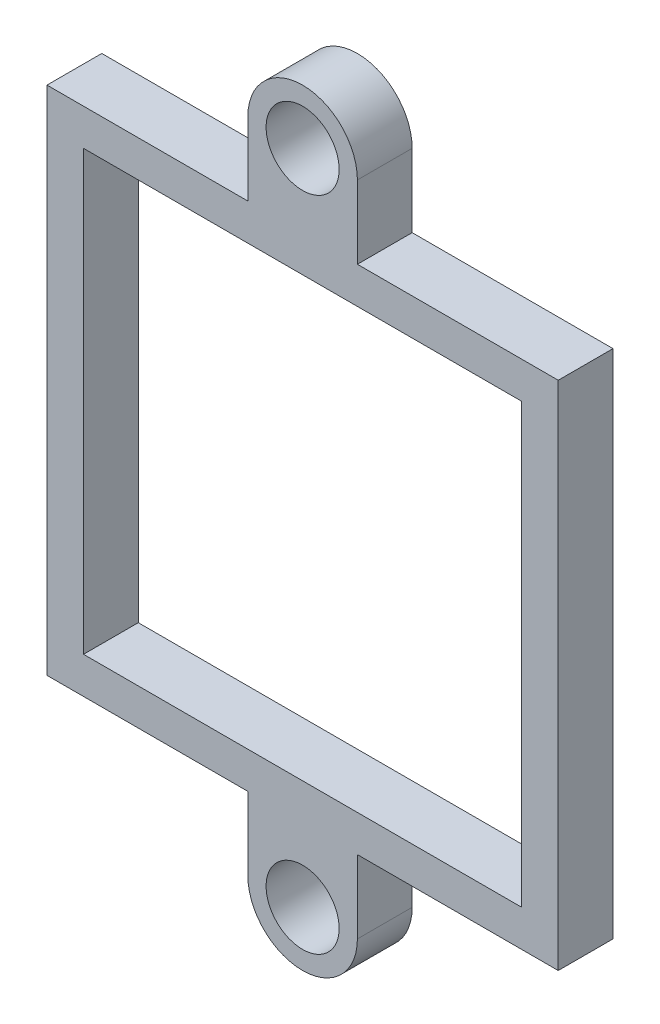
ISO-10303-21;
HEADER;
FILE_DESCRIPTION(('STEP AP214'),'2;1');
FILE_NAME('part.step','',(''),(''),'','','');
FILE_SCHEMA(('AUTOMOTIVE_DESIGN { 1 0 10303 214 1 1 1 1 }'));
ENDSEC;
DATA;
#1=APPLICATION_CONTEXT('core data for automotive mechanical design processes');
#2=APPLICATION_PROTOCOL_DEFINITION('international standard','automotive_design',2000,#1);
#3=PRODUCT_CONTEXT('',#1,'mechanical');
#4=PRODUCT('Part','Part','',(#3));
#5=PRODUCT_RELATED_PRODUCT_CATEGORY('part','',(#4));
#6=PRODUCT_DEFINITION_FORMATION('','',#4);
#7=PRODUCT_DEFINITION_CONTEXT('part definition',#1,'design');
#8=PRODUCT_DEFINITION('design','',#6,#7);
#9=PRODUCT_DEFINITION_SHAPE('','',#8);
#10=(LENGTH_UNIT() NAMED_UNIT(*) SI_UNIT(.MILLI.,.METRE.));
#11=(NAMED_UNIT(*) PLANE_ANGLE_UNIT() SI_UNIT($,.RADIAN.));
#12=(NAMED_UNIT(*) SI_UNIT($,.STERADIAN.) SOLID_ANGLE_UNIT());
#13=UNCERTAINTY_MEASURE_WITH_UNIT(LENGTH_MEASURE(1.E-05),#10,'distance_accuracy_value','');
#14=(GEOMETRIC_REPRESENTATION_CONTEXT(3) GLOBAL_UNCERTAINTY_ASSIGNED_CONTEXT((#13)) GLOBAL_UNIT_ASSIGNED_CONTEXT((#10,
#11,#12)) REPRESENTATION_CONTEXT('',''));
#15=CARTESIAN_POINT('',(0.,0.,0.));
#16=DIRECTION('',(0.,0.,1.));
#17=DIRECTION('',(1.,0.,0.));
#18=AXIS2_PLACEMENT_3D('',#15,#16,#17);
#19=CARTESIAN_POINT('',(-1.5,10.5,0.));
#20=DIRECTION('',(-1.,0.,0.));
#21=DIRECTION('',(0.,0.,1.));
#22=AXIS2_PLACEMENT_3D('',#19,#20,#21);
#23=PLANE('',#22);
#24=DIRECTION('',(0.,-1.,0.));
#25=VECTOR('',#24,1.);
#26=CARTESIAN_POINT('',(-1.5,10.5,1.5));
#27=LINE('',#26,#25);
#28=CARTESIAN_POINT('',(-1.5,9.,1.5));
#29=VERTEX_POINT('',#28);
#30=CARTESIAN_POINT('',(-1.5,7.,1.5));
#31=VERTEX_POINT('',#30);
#32=EDGE_CURVE('E204',#29,#31,#27,.T.);
#33=ORIENTED_EDGE('',*,*,#32,.F.);
#34=DIRECTION('',(0.,0.,1.));
#35=VECTOR('',#34,1.);
#36=CARTESIAN_POINT('',(-1.5,9.,-2.5));
#37=LINE('',#36,#35);
#38=CARTESIAN_POINT('',(-1.5,9.,0.));
#39=VERTEX_POINT('',#38);
#40=EDGE_CURVE('E190',#39,#29,#37,.T.);
#41=ORIENTED_EDGE('',*,*,#40,.F.);
#42=DIRECTION('',(0.,-1.,0.));
#43=VECTOR('',#42,1.);
#44=CARTESIAN_POINT('',(-1.5,10.5,0.));
#45=LINE('',#44,#43);
#46=CARTESIAN_POINT('',(-1.5,7.,0.));
#47=VERTEX_POINT('',#46);
#48=EDGE_CURVE('E87',#39,#47,#45,.T.);
#49=ORIENTED_EDGE('',*,*,#48,.T.);
#50=DIRECTION('',(0.,0.,-1.));
#51=VECTOR('',#50,1.);
#52=CARTESIAN_POINT('',(-1.5,7.,0.));
#53=LINE('',#52,#51);
#54=EDGE_CURVE('E205',#31,#47,#53,.T.);
#55=ORIENTED_EDGE('',*,*,#54,.F.);
#56=EDGE_LOOP('',(#33,#41,#49,#55));
#57=FACE_BOUND('',#56,.T.);
#58=ADVANCED_FACE('F71',(#57),#23,.T.);
#59=CARTESIAN_POINT('',(-7.,7.,1.5));
#60=DIRECTION('',(0.,-1.,0.));
#61=DIRECTION('',(1.,0.,0.));
#62=AXIS2_PLACEMENT_3D('',#59,#60,#61);
#63=PLANE('',#62);
#64=DIRECTION('',(-1.,0.,0.));
#65=VECTOR('',#64,1.);
#66=CARTESIAN_POINT('',(-7.,7.,0.));
#67=LINE('',#66,#65);
#68=CARTESIAN_POINT('',(7.,7.,0.));
#69=VERTEX_POINT('',#68);
#70=CARTESIAN_POINT('',(1.5,7.,0.));
#71=VERTEX_POINT('',#70);
#72=EDGE_CURVE('E275',#69,#71,#67,.T.);
#73=ORIENTED_EDGE('',*,*,#72,.T.);
#74=DIRECTION('',(0.,0.,1.));
#75=VECTOR('',#74,1.);
#76=CARTESIAN_POINT('',(1.5,7.,0.));
#77=LINE('',#76,#75);
#78=CARTESIAN_POINT('',(1.5,7.,1.5));
#79=VERTEX_POINT('',#78);
#80=EDGE_CURVE('E208',#71,#79,#77,.T.);
#81=ORIENTED_EDGE('',*,*,#80,.T.);
#82=DIRECTION('',(-1.,0.,0.));
#83=VECTOR('',#82,1.);
#84=CARTESIAN_POINT('',(-7.,7.,1.5));
#85=LINE('',#84,#83);
#86=CARTESIAN_POINT('',(7.,7.,1.5));
#87=VERTEX_POINT('',#86);
#88=EDGE_CURVE('E203',#87,#79,#85,.T.);
#89=ORIENTED_EDGE('',*,*,#88,.F.);
#90=DIRECTION('',(0.,0.,-1.));
#91=VECTOR('',#90,1.);
#92=CARTESIAN_POINT('',(7.,7.,1.5));
#93=LINE('',#92,#91);
#94=EDGE_CURVE('E297',#87,#69,#93,.T.);
#95=ORIENTED_EDGE('',*,*,#94,.T.);
#96=EDGE_LOOP('',(#73,#81,#89,#95));
#97=FACE_BOUND('',#96,.T.);
#98=ADVANCED_FACE('F348',(#97),#63,.F.);
#99=CARTESIAN_POINT('',(0.,0.,1.5));
#100=DIRECTION('',(0.,0.,-1.));
#101=DIRECTION('',(-1.,0.,0.));
#102=AXIS2_PLACEMENT_3D('',#99,#100,#101);
#103=PLANE('',#102);
#104=CARTESIAN_POINT('',(0.,9.,1.5));
#105=DIRECTION('',(0.,0.,-1.));
#106=DIRECTION('',(1.,0.,0.));
#107=AXIS2_PLACEMENT_3D('',#104,#105,#106);
#108=CIRCLE('',#107,1.);
#109=CARTESIAN_POINT('',(1.,9.,1.5));
#110=VERTEX_POINT('',#109);
#111=EDGE_CURVE('E395',#110,#110,#108,.T.);
#112=ORIENTED_EDGE('',*,*,#111,.T.);
#113=EDGE_LOOP('',(#112));
#114=FACE_BOUND('',#113,.T.);
#115=CARTESIAN_POINT('',(0.,-9.,1.5));
#116=DIRECTION('',(0.,0.,1.));
#117=DIRECTION('',(1.,0.,0.));
#118=AXIS2_PLACEMENT_3D('',#115,#116,#117);
#119=CIRCLE('',#118,1.);
#120=CARTESIAN_POINT('',(1.,-9.,1.5));
#121=VERTEX_POINT('',#120);
#122=EDGE_CURVE('E214',#121,#121,#119,.T.);
#123=ORIENTED_EDGE('',*,*,#122,.F.);
#124=EDGE_LOOP('',(#123));
#125=FACE_BOUND('',#124,.T.);
#126=DIRECTION('',(0.,1.,0.));
#127=VECTOR('',#126,1.);
#128=CARTESIAN_POINT('',(6.,-6.,1.5));
#129=LINE('',#128,#127);
#130=CARTESIAN_POINT('',(6.,-6.,1.5));
#131=VERTEX_POINT('',#130);
#132=CARTESIAN_POINT('',(6.,6.,1.5));
#133=VERTEX_POINT('',#132);
#134=EDGE_CURVE('E240',#131,#133,#129,.T.);
#135=ORIENTED_EDGE('',*,*,#134,.F.);
#136=DIRECTION('',(1.,0.,0.));
#137=VECTOR('',#136,1.);
#138=CARTESIAN_POINT('',(-6.,-6.,1.5));
#139=LINE('',#138,#137);
#140=CARTESIAN_POINT('',(-6.,-6.,1.5));
#141=VERTEX_POINT('',#140);
#142=EDGE_CURVE('E248',#141,#131,#139,.T.);
#143=ORIENTED_EDGE('',*,*,#142,.F.);
#144=DIRECTION('',(0.,-1.,0.));
#145=VECTOR('',#144,1.);
#146=CARTESIAN_POINT('',(-6.,-6.,1.5));
#147=LINE('',#146,#145);
#148=CARTESIAN_POINT('',(-6.,6.,1.5));
#149=VERTEX_POINT('',#148);
#150=EDGE_CURVE('E245',#149,#141,#147,.T.);
#151=ORIENTED_EDGE('',*,*,#150,.F.);
#152=DIRECTION('',(-1.,0.,0.));
#153=VECTOR('',#152,1.);
#154=CARTESIAN_POINT('',(-6.,6.,1.5));
#155=LINE('',#154,#153);
#156=EDGE_CURVE('E242',#133,#149,#155,.T.);
#157=ORIENTED_EDGE('',*,*,#156,.F.);
#158=EDGE_LOOP('',(#135,#143,#151,#157));
#159=FACE_BOUND('',#158,.T.);
#160=DIRECTION('',(0.,-1.,0.));
#161=VECTOR('',#160,1.);
#162=CARTESIAN_POINT('',(1.5,10.5,1.5));
#163=LINE('',#162,#161);
#164=CARTESIAN_POINT('',(1.5,9.,1.5));
#165=VERTEX_POINT('',#164);
#166=EDGE_CURVE('E197',#165,#79,#163,.T.);
#167=ORIENTED_EDGE('',*,*,#166,.F.);
#168=CARTESIAN_POINT('',(0.,9.,1.5));
#169=DIRECTION('',(0.,0.,-1.));
#170=DIRECTION('',(1.,0.,0.));
#171=AXIS2_PLACEMENT_3D('',#168,#169,#170);
#172=CIRCLE('',#171,1.5);
#173=EDGE_CURVE('E186',#29,#165,#172,.T.);
#174=ORIENTED_EDGE('',*,*,#173,.F.);
#175=ORIENTED_EDGE('',*,*,#32,.T.);
#176=CARTESIAN_POINT('',(-7.,7.,1.5));
#177=VERTEX_POINT('',#176);
#178=EDGE_CURVE('E281',#31,#177,#85,.T.);
#179=ORIENTED_EDGE('',*,*,#178,.T.);
#180=DIRECTION('',(0.,-1.,0.));
#181=VECTOR('',#180,1.);
#182=CARTESIAN_POINT('',(-7.,-7.,1.5));
#183=LINE('',#182,#181);
#184=CARTESIAN_POINT('',(-7.,-7.,1.5));
#185=VERTEX_POINT('',#184);
#186=EDGE_CURVE('E271',#177,#185,#183,.T.);
#187=ORIENTED_EDGE('',*,*,#186,.T.);
#188=DIRECTION('',(1.,0.,0.));
#189=VECTOR('',#188,1.);
#190=CARTESIAN_POINT('',(-7.,-7.,1.5));
#191=LINE('',#190,#189);
#192=CARTESIAN_POINT('',(-1.5,-7.,1.5));
#193=VERTEX_POINT('',#192);
#194=EDGE_CURVE('E276',#185,#193,#191,.T.);
#195=ORIENTED_EDGE('',*,*,#194,.T.);
#196=DIRECTION('',(0.,1.,0.));
#197=VECTOR('',#196,1.);
#198=CARTESIAN_POINT('',(-1.5,-10.5,1.5));
#199=LINE('',#198,#197);
#200=CARTESIAN_POINT('',(-1.5,-9.,1.5));
#201=VERTEX_POINT('',#200);
#202=EDGE_CURVE('E236',#201,#193,#199,.T.);
#203=ORIENTED_EDGE('',*,*,#202,.F.);
#204=CARTESIAN_POINT('',(0.,-9.,1.5));
#205=DIRECTION('',(0.,0.,1.));
#206=DIRECTION('',(1.,0.,0.));
#207=AXIS2_PLACEMENT_3D('',#204,#205,#206);
#208=CIRCLE('',#207,1.5);
#209=CARTESIAN_POINT('',(1.5,-9.,1.5));
#210=VERTEX_POINT('',#209);
#211=EDGE_CURVE('E218',#201,#210,#208,.T.);
#212=ORIENTED_EDGE('',*,*,#211,.T.);
#213=DIRECTION('',(0.,1.,0.));
#214=VECTOR('',#213,1.);
#215=CARTESIAN_POINT('',(1.5,-10.5,1.5));
#216=LINE('',#215,#214);
#217=CARTESIAN_POINT('',(1.5,-7.,1.5));
#218=VERTEX_POINT('',#217);
#219=EDGE_CURVE('E95',#210,#218,#216,.T.);
#220=ORIENTED_EDGE('',*,*,#219,.T.);
#221=CARTESIAN_POINT('',(7.,-7.,1.5));
#222=VERTEX_POINT('',#221);
#223=EDGE_CURVE('E274',#218,#222,#191,.T.);
#224=ORIENTED_EDGE('',*,*,#223,.T.);
#225=DIRECTION('',(0.,1.,0.));
#226=VECTOR('',#225,1.);
#227=CARTESIAN_POINT('',(7.,-7.,1.5));
#228=LINE('',#227,#226);
#229=EDGE_CURVE('E279',#222,#87,#228,.T.);
#230=ORIENTED_EDGE('',*,*,#229,.T.);
#231=ORIENTED_EDGE('',*,*,#88,.T.);
#232=EDGE_LOOP('',(#167,#174,#175,#179,#187,#195,#203,#212,#220,#224,#230,#231));
#233=FACE_BOUND('',#232,.T.);
#234=ADVANCED_FACE('F201',(#114,#125,#159,#233),#103,.F.);
#235=CARTESIAN_POINT('',(0.,0.,0.));
#236=DIRECTION('',(0.,0.,-1.));
#237=DIRECTION('',(-1.,0.,0.));
#238=AXIS2_PLACEMENT_3D('',#235,#236,#237);
#239=PLANE('',#238);
#240=CARTESIAN_POINT('',(0.,9.,0.));
#241=DIRECTION('',(0.,0.,-1.));
#242=DIRECTION('',(-1.,0.,0.));
#243=AXIS2_PLACEMENT_3D('',#240,#241,#242);
#244=CIRCLE('',#243,1.);
#245=CARTESIAN_POINT('',(-1.,9.,0.));
#246=VERTEX_POINT('',#245);
#247=EDGE_CURVE('E75',#246,#246,#244,.F.);
#248=ORIENTED_EDGE('',*,*,#247,.T.);
#249=EDGE_LOOP('',(#248));
#250=FACE_BOUND('',#249,.T.);
#251=CARTESIAN_POINT('',(0.,9.,0.));
#252=DIRECTION('',(0.,0.,-1.));
#253=DIRECTION('',(-1.,0.,0.));
#254=AXIS2_PLACEMENT_3D('',#251,#252,#253);
#255=CIRCLE('',#254,1.5);
#256=CARTESIAN_POINT('',(1.5,9.,0.));
#257=VERTEX_POINT('',#256);
#258=EDGE_CURVE('E391',#257,#39,#255,.F.);
#259=ORIENTED_EDGE('',*,*,#258,.F.);
#260=DIRECTION('',(0.,-1.,0.));
#261=VECTOR('',#260,1.);
#262=CARTESIAN_POINT('',(1.5,10.5,0.));
#263=LINE('',#262,#261);
#264=EDGE_CURVE('E199',#257,#71,#263,.T.);
#265=ORIENTED_EDGE('',*,*,#264,.T.);
#266=ORIENTED_EDGE('',*,*,#72,.F.);
#267=DIRECTION('',(0.,1.,0.));
#268=VECTOR('',#267,1.);
#269=CARTESIAN_POINT('',(7.,-7.,0.));
#270=LINE('',#269,#268);
#271=CARTESIAN_POINT('',(7.,-7.,0.));
#272=VERTEX_POINT('',#271);
#273=EDGE_CURVE('E290',#272,#69,#270,.T.);
#274=ORIENTED_EDGE('',*,*,#273,.F.);
#275=DIRECTION('',(1.,0.,0.));
#276=VECTOR('',#275,1.);
#277=CARTESIAN_POINT('',(-7.,-7.,0.));
#278=LINE('',#277,#276);
#279=CARTESIAN_POINT('',(1.5,-7.,0.));
#280=VERTEX_POINT('',#279);
#281=EDGE_CURVE('E286',#280,#272,#278,.T.);
#282=ORIENTED_EDGE('',*,*,#281,.F.);
#283=DIRECTION('',(0.,1.,0.));
#284=VECTOR('',#283,1.);
#285=CARTESIAN_POINT('',(1.5,-10.5,0.));
#286=LINE('',#285,#284);
#287=CARTESIAN_POINT('',(1.5,-9.,0.));
#288=VERTEX_POINT('',#287);
#289=EDGE_CURVE('E232',#288,#280,#286,.T.);
#290=ORIENTED_EDGE('',*,*,#289,.F.);
#291=CARTESIAN_POINT('',(0.,-9.,0.));
#292=DIRECTION('',(0.,0.,-1.));
#293=DIRECTION('',(-1.,0.,0.));
#294=AXIS2_PLACEMENT_3D('',#291,#292,#293);
#295=CIRCLE('',#294,1.5);
#296=CARTESIAN_POINT('',(-1.5,-9.,0.));
#297=VERTEX_POINT('',#296);
#298=EDGE_CURVE('E223',#288,#297,#295,.T.);
#299=ORIENTED_EDGE('',*,*,#298,.T.);
#300=DIRECTION('',(0.,1.,0.));
#301=VECTOR('',#300,1.);
#302=CARTESIAN_POINT('',(-1.5,-10.5,0.));
#303=LINE('',#302,#301);
#304=CARTESIAN_POINT('',(-1.5,-7.,0.));
#305=VERTEX_POINT('',#304);
#306=EDGE_CURVE('E234',#297,#305,#303,.T.);
#307=ORIENTED_EDGE('',*,*,#306,.T.);
#308=CARTESIAN_POINT('',(-7.,-7.,0.));
#309=VERTEX_POINT('',#308);
#310=EDGE_CURVE('E287',#309,#305,#278,.T.);
#311=ORIENTED_EDGE('',*,*,#310,.F.);
#312=DIRECTION('',(0.,-1.,0.));
#313=VECTOR('',#312,1.);
#314=CARTESIAN_POINT('',(-7.,-7.,0.));
#315=LINE('',#314,#313);
#316=CARTESIAN_POINT('',(-7.,7.,0.));
#317=VERTEX_POINT('',#316);
#318=EDGE_CURVE('E270',#317,#309,#315,.T.);
#319=ORIENTED_EDGE('',*,*,#318,.F.);
#320=EDGE_CURVE('E292',#47,#317,#67,.T.);
#321=ORIENTED_EDGE('',*,*,#320,.F.);
#322=ORIENTED_EDGE('',*,*,#48,.F.);
#323=EDGE_LOOP('',(#259,#265,#266,#274,#282,#290,#299,#307,#311,#319,#321,#322));
#324=FACE_BOUND('',#323,.T.);
#325=CARTESIAN_POINT('',(0.,-9.,0.));
#326=DIRECTION('',(0.,0.,-1.));
#327=DIRECTION('',(-1.,0.,0.));
#328=AXIS2_PLACEMENT_3D('',#325,#326,#327);
#329=CIRCLE('',#328,1.);
#330=CARTESIAN_POINT('',(-1.,-9.,0.));
#331=VERTEX_POINT('',#330);
#332=EDGE_CURVE('E217',#331,#331,#329,.T.);
#333=ORIENTED_EDGE('',*,*,#332,.F.);
#334=EDGE_LOOP('',(#333));
#335=FACE_BOUND('',#334,.T.);
#336=DIRECTION('',(1.,0.,0.));
#337=VECTOR('',#336,1.);
#338=CARTESIAN_POINT('',(-6.,-6.,0.));
#339=LINE('',#338,#337);
#340=CARTESIAN_POINT('',(-6.,-6.,0.));
#341=VERTEX_POINT('',#340);
#342=CARTESIAN_POINT('',(6.,-6.,0.));
#343=VERTEX_POINT('',#342);
#344=EDGE_CURVE('E243',#341,#343,#339,.T.);
#345=ORIENTED_EDGE('',*,*,#344,.T.);
#346=DIRECTION('',(0.,1.,0.));
#347=VECTOR('',#346,1.);
#348=CARTESIAN_POINT('',(6.,-6.,0.));
#349=LINE('',#348,#347);
#350=CARTESIAN_POINT('',(6.,6.,0.));
#351=VERTEX_POINT('',#350);
#352=EDGE_CURVE('E239',#343,#351,#349,.T.);
#353=ORIENTED_EDGE('',*,*,#352,.T.);
#354=DIRECTION('',(-1.,0.,0.));
#355=VECTOR('',#354,1.);
#356=CARTESIAN_POINT('',(-6.,6.,0.));
#357=LINE('',#356,#355);
#358=CARTESIAN_POINT('',(-6.,6.,0.));
#359=VERTEX_POINT('',#358);
#360=EDGE_CURVE('E253',#351,#359,#357,.T.);
#361=ORIENTED_EDGE('',*,*,#360,.T.);
#362=DIRECTION('',(0.,-1.,0.));
#363=VECTOR('',#362,1.);
#364=CARTESIAN_POINT('',(-6.,-6.,0.));
#365=LINE('',#364,#363);
#366=EDGE_CURVE('E256',#359,#341,#365,.T.);
#367=ORIENTED_EDGE('',*,*,#366,.T.);
#368=EDGE_LOOP('',(#345,#353,#361,#367));
#369=FACE_BOUND('',#368,.T.);
#370=ADVANCED_FACE('F314',(#250,#324,#335,#369),#239,.T.);
#371=CARTESIAN_POINT('',(1.5,-10.5,0.));
#372=DIRECTION('',(-1.,0.,0.));
#373=DIRECTION('',(0.,0.,1.));
#374=AXIS2_PLACEMENT_3D('',#371,#372,#373);
#375=PLANE('',#374);
#376=DIRECTION('',(0.,0.,1.));
#377=VECTOR('',#376,1.);
#378=CARTESIAN_POINT('',(1.5,-9.,-2.5));
#379=LINE('',#378,#377);
#380=EDGE_CURVE('E80',#288,#210,#379,.T.);
#381=ORIENTED_EDGE('',*,*,#380,.F.);
#382=ORIENTED_EDGE('',*,*,#289,.T.);
#383=DIRECTION('',(0.,0.,1.));
#384=VECTOR('',#383,1.);
#385=CARTESIAN_POINT('',(1.5,-7.,0.));
#386=LINE('',#385,#384);
#387=EDGE_CURVE('E226',#280,#218,#386,.T.);
#388=ORIENTED_EDGE('',*,*,#387,.T.);
#389=ORIENTED_EDGE('',*,*,#219,.F.);
#390=EDGE_LOOP('',(#381,#382,#388,#389));
#391=FACE_BOUND('',#390,.T.);
#392=ADVANCED_FACE('F317',(#391),#375,.F.);
#393=CARTESIAN_POINT('',(-7.,-7.,1.5));
#394=DIRECTION('',(0.,1.,0.));
#395=DIRECTION('',(0.,0.,1.));
#396=AXIS2_PLACEMENT_3D('',#393,#394,#395);
#397=PLANE('',#396);
#398=ORIENTED_EDGE('',*,*,#387,.F.);
#399=ORIENTED_EDGE('',*,*,#281,.T.);
#400=DIRECTION('',(0.,0.,-1.));
#401=VECTOR('',#400,1.);
#402=CARTESIAN_POINT('',(7.,-7.,1.5));
#403=LINE('',#402,#401);
#404=EDGE_CURVE('E300',#222,#272,#403,.T.);
#405=ORIENTED_EDGE('',*,*,#404,.F.);
#406=ORIENTED_EDGE('',*,*,#223,.F.);
#407=EDGE_LOOP('',(#398,#399,#405,#406));
#408=FACE_BOUND('',#407,.T.);
#409=ADVANCED_FACE('F371',(#408),#397,.F.);
#410=DIRECTION('',(0.,0.,-1.));
#411=VECTOR('',#410,1.);
#412=CARTESIAN_POINT('',(-1.5,-7.,0.));
#413=LINE('',#412,#411);
#414=EDGE_CURVE('E229',#193,#305,#413,.T.);
#415=ORIENTED_EDGE('',*,*,#414,.F.);
#416=ORIENTED_EDGE('',*,*,#194,.F.);
#417=DIRECTION('',(0.,0.,-1.));
#418=VECTOR('',#417,1.);
#419=CARTESIAN_POINT('',(-7.,-7.,1.5));
#420=LINE('',#419,#418);
#421=EDGE_CURVE('E303',#185,#309,#420,.T.);
#422=ORIENTED_EDGE('',*,*,#421,.T.);
#423=ORIENTED_EDGE('',*,*,#310,.T.);
#424=EDGE_LOOP('',(#415,#416,#422,#423));
#425=FACE_BOUND('',#424,.T.);
#426=ADVANCED_FACE('F376',(#425),#397,.F.);
#427=CARTESIAN_POINT('',(-7.,-7.,1.5));
#428=DIRECTION('',(1.,0.,0.));
#429=DIRECTION('',(0.,0.,-1.));
#430=AXIS2_PLACEMENT_3D('',#427,#428,#429);
#431=PLANE('',#430);
#432=ORIENTED_EDGE('',*,*,#318,.T.);
#433=ORIENTED_EDGE('',*,*,#421,.F.);
#434=ORIENTED_EDGE('',*,*,#186,.F.);
#435=DIRECTION('',(0.,0.,-1.));
#436=VECTOR('',#435,1.);
#437=CARTESIAN_POINT('',(-7.,7.,1.5));
#438=LINE('',#437,#436);
#439=EDGE_CURVE('E283',#177,#317,#438,.T.);
#440=ORIENTED_EDGE('',*,*,#439,.T.);
#441=EDGE_LOOP('',(#432,#433,#434,#440));
#442=FACE_BOUND('',#441,.T.);
#443=ADVANCED_FACE('F73',(#442),#431,.F.);
#444=CARTESIAN_POINT('',(7.,-7.,1.5));
#445=DIRECTION('',(-1.,0.,0.));
#446=DIRECTION('',(0.,-1.,0.));
#447=AXIS2_PLACEMENT_3D('',#444,#445,#446);
#448=PLANE('',#447);
#449=ORIENTED_EDGE('',*,*,#273,.T.);
#450=ORIENTED_EDGE('',*,*,#94,.F.);
#451=ORIENTED_EDGE('',*,*,#229,.F.);
#452=ORIENTED_EDGE('',*,*,#404,.T.);
#453=EDGE_LOOP('',(#449,#450,#451,#452));
#454=FACE_BOUND('',#453,.T.);
#455=ADVANCED_FACE('F389',(#454),#448,.F.);
#456=ORIENTED_EDGE('',*,*,#178,.F.);
#457=ORIENTED_EDGE('',*,*,#54,.T.);
#458=ORIENTED_EDGE('',*,*,#320,.T.);
#459=ORIENTED_EDGE('',*,*,#439,.F.);
#460=EDGE_LOOP('',(#456,#457,#458,#459));
#461=FACE_BOUND('',#460,.T.);
#462=ADVANCED_FACE('F355',(#461),#63,.F.);
#463=CARTESIAN_POINT('',(6.,-6.,1.5));
#464=DIRECTION('',(-1.,0.,0.));
#465=DIRECTION('',(0.,0.,1.));
#466=AXIS2_PLACEMENT_3D('',#463,#464,#465);
#467=PLANE('',#466);
#468=ORIENTED_EDGE('',*,*,#352,.F.);
#469=DIRECTION('',(0.,0.,-1.));
#470=VECTOR('',#469,1.);
#471=CARTESIAN_POINT('',(6.,-6.,1.5));
#472=LINE('',#471,#470);
#473=EDGE_CURVE('E250',#131,#343,#472,.T.);
#474=ORIENTED_EDGE('',*,*,#473,.F.);
#475=ORIENTED_EDGE('',*,*,#134,.T.);
#476=DIRECTION('',(0.,0.,-1.));
#477=VECTOR('',#476,1.);
#478=CARTESIAN_POINT('',(6.,6.,1.5));
#479=LINE('',#478,#477);
#480=EDGE_CURVE('E267',#133,#351,#479,.T.);
#481=ORIENTED_EDGE('',*,*,#480,.T.);
#482=EDGE_LOOP('',(#468,#474,#475,#481));
#483=FACE_BOUND('',#482,.T.);
#484=ADVANCED_FACE('F328',(#483),#467,.T.);
#485=CARTESIAN_POINT('',(-6.,6.,1.5));
#486=DIRECTION('',(0.,-1.,0.));
#487=DIRECTION('',(0.,0.,-1.));
#488=AXIS2_PLACEMENT_3D('',#485,#486,#487);
#489=PLANE('',#488);
#490=ORIENTED_EDGE('',*,*,#360,.F.);
#491=ORIENTED_EDGE('',*,*,#480,.F.);
#492=ORIENTED_EDGE('',*,*,#156,.T.);
#493=DIRECTION('',(0.,0.,-1.));
#494=VECTOR('',#493,1.);
#495=CARTESIAN_POINT('',(-6.,6.,1.5));
#496=LINE('',#495,#494);
#497=EDGE_CURVE('E265',#149,#359,#496,.T.);
#498=ORIENTED_EDGE('',*,*,#497,.T.);
#499=EDGE_LOOP('',(#490,#491,#492,#498));
#500=FACE_BOUND('',#499,.T.);
#501=ADVANCED_FACE('F335',(#500),#489,.T.);
#502=CARTESIAN_POINT('',(-6.,-6.,1.5));
#503=DIRECTION('',(1.,0.,0.));
#504=DIRECTION('',(0.,0.,-1.));
#505=AXIS2_PLACEMENT_3D('',#502,#503,#504);
#506=PLANE('',#505);
#507=ORIENTED_EDGE('',*,*,#366,.F.);
#508=ORIENTED_EDGE('',*,*,#497,.F.);
#509=ORIENTED_EDGE('',*,*,#150,.T.);
#510=DIRECTION('',(0.,0.,-1.));
#511=VECTOR('',#510,1.);
#512=CARTESIAN_POINT('',(-6.,-6.,1.5));
#513=LINE('',#512,#511);
#514=EDGE_CURVE('E263',#141,#341,#513,.T.);
#515=ORIENTED_EDGE('',*,*,#514,.T.);
#516=EDGE_LOOP('',(#507,#508,#509,#515));
#517=FACE_BOUND('',#516,.T.);
#518=ADVANCED_FACE('F337',(#517),#506,.T.);
#519=CARTESIAN_POINT('',(-6.,-6.,1.5));
#520=DIRECTION('',(0.,1.,0.));
#521=DIRECTION('',(0.,0.,1.));
#522=AXIS2_PLACEMENT_3D('',#519,#520,#521);
#523=PLANE('',#522);
#524=ORIENTED_EDGE('',*,*,#344,.F.);
#525=ORIENTED_EDGE('',*,*,#514,.F.);
#526=ORIENTED_EDGE('',*,*,#142,.T.);
#527=ORIENTED_EDGE('',*,*,#473,.T.);
#528=EDGE_LOOP('',(#524,#525,#526,#527));
#529=FACE_BOUND('',#528,.T.);
#530=ADVANCED_FACE('F323',(#529),#523,.T.);
#531=CARTESIAN_POINT('',(-1.5,-10.5,0.));
#532=DIRECTION('',(1.,0.,0.));
#533=DIRECTION('',(0.,0.,-1.));
#534=AXIS2_PLACEMENT_3D('',#531,#532,#533);
#535=PLANE('',#534);
#536=ORIENTED_EDGE('',*,*,#306,.F.);
#537=DIRECTION('',(0.,0.,1.));
#538=VECTOR('',#537,1.);
#539=CARTESIAN_POINT('',(-1.5,-9.,-2.5));
#540=LINE('',#539,#538);
#541=EDGE_CURVE('E220',#297,#201,#540,.T.);
#542=ORIENTED_EDGE('',*,*,#541,.T.);
#543=ORIENTED_EDGE('',*,*,#202,.T.);
#544=ORIENTED_EDGE('',*,*,#414,.T.);
#545=EDGE_LOOP('',(#536,#542,#543,#544));
#546=FACE_BOUND('',#545,.T.);
#547=ADVANCED_FACE('F344',(#546),#535,.F.);
#548=CARTESIAN_POINT('',(0.,-9.,-2.5));
#549=DIRECTION('',(0.,0.,1.));
#550=DIRECTION('',(1.,0.,0.));
#551=AXIS2_PLACEMENT_3D('',#548,#549,#550);
#552=CYLINDRICAL_SURFACE('',#551,1.5);
#553=ORIENTED_EDGE('',*,*,#298,.F.);
#554=ORIENTED_EDGE('',*,*,#380,.T.);
#555=ORIENTED_EDGE('',*,*,#211,.F.);
#556=ORIENTED_EDGE('',*,*,#541,.F.);
#557=EDGE_LOOP('',(#553,#554,#555,#556));
#558=FACE_BOUND('',#557,.T.);
#559=ADVANCED_FACE('F363',(#558),#552,.T.);
#560=CARTESIAN_POINT('',(0.,-9.,-2.5));
#561=DIRECTION('',(0.,0.,1.));
#562=DIRECTION('',(1.,0.,0.));
#563=AXIS2_PLACEMENT_3D('',#560,#561,#562);
#564=CYLINDRICAL_SURFACE('',#563,1.);
#565=ORIENTED_EDGE('',*,*,#332,.T.);
#566=EDGE_LOOP('',(#565));
#567=FACE_BOUND('',#566,.T.);
#568=ORIENTED_EDGE('',*,*,#122,.T.);
#569=EDGE_LOOP('',(#568));
#570=FACE_BOUND('',#569,.T.);
#571=ADVANCED_FACE('F311',(#567,#570),#564,.F.);
#572=CARTESIAN_POINT('',(1.5,10.5,0.));
#573=DIRECTION('',(1.,0.,0.));
#574=DIRECTION('',(0.,0.,-1.));
#575=AXIS2_PLACEMENT_3D('',#572,#573,#574);
#576=PLANE('',#575);
#577=DIRECTION('',(0.,0.,1.));
#578=VECTOR('',#577,1.);
#579=CARTESIAN_POINT('',(1.5,9.,-2.5));
#580=LINE('',#579,#578);
#581=EDGE_CURVE('E12',#165,#257,#580,.F.);
#582=ORIENTED_EDGE('',*,*,#581,.F.);
#583=ORIENTED_EDGE('',*,*,#166,.T.);
#584=ORIENTED_EDGE('',*,*,#80,.F.);
#585=ORIENTED_EDGE('',*,*,#264,.F.);
#586=EDGE_LOOP('',(#582,#583,#584,#585));
#587=FACE_BOUND('',#586,.T.);
#588=ADVANCED_FACE('F195',(#587),#576,.T.);
#589=CARTESIAN_POINT('',(0.,9.,-2.5));
#590=DIRECTION('',(0.,0.,1.));
#591=DIRECTION('',(1.,0.,0.));
#592=AXIS2_PLACEMENT_3D('',#589,#590,#591);
#593=CYLINDRICAL_SURFACE('',#592,1.5);
#594=ORIENTED_EDGE('',*,*,#258,.T.);
#595=ORIENTED_EDGE('',*,*,#40,.T.);
#596=ORIENTED_EDGE('',*,*,#173,.T.);
#597=ORIENTED_EDGE('',*,*,#581,.T.);
#598=EDGE_LOOP('',(#594,#595,#596,#597));
#599=FACE_BOUND('',#598,.T.);
#600=ADVANCED_FACE('F188',(#599),#593,.T.);
#601=CARTESIAN_POINT('',(0.,9.,-2.5));
#602=DIRECTION('',(0.,0.,1.));
#603=DIRECTION('',(1.,0.,0.));
#604=AXIS2_PLACEMENT_3D('',#601,#602,#603);
#605=CYLINDRICAL_SURFACE('',#604,1.);
#606=ORIENTED_EDGE('',*,*,#247,.F.);
#607=EDGE_LOOP('',(#606));
#608=FACE_BOUND('',#607,.T.);
#609=ORIENTED_EDGE('',*,*,#111,.F.);
#610=EDGE_LOOP('',(#609));
#611=FACE_BOUND('',#610,.T.);
#612=ADVANCED_FACE('F402',(#608,#611),#605,.F.);
#613=CLOSED_SHELL('',(#58,#98,#234,#370,#392,#409,#426,#443,#455,#462,#484,#501,#518,#530,#547,
#559,#571,#588,#600,#612));
#614=MANIFOLD_SOLID_BREP('B2',#613);
#615=ADVANCED_BREP_SHAPE_REPRESENTATION('',(#18,#614),#14);
#616=SHAPE_DEFINITION_REPRESENTATION(#9,#615);
ENDSEC;
END-ISO-10303-21;
